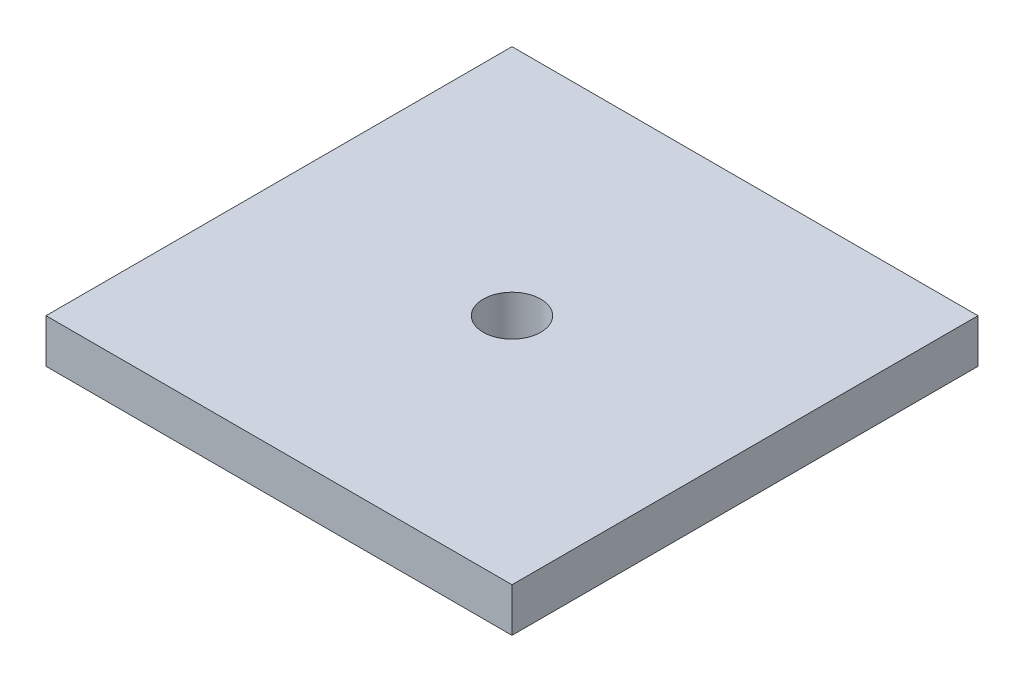
ISO-10303-21;
HEADER;
FILE_DESCRIPTION(('STEP AP214'),'2;1');
FILE_NAME('part.step','',(''),(''),'','','');
FILE_SCHEMA(('AUTOMOTIVE_DESIGN { 1 0 10303 214 1 1 1 1 }'));
ENDSEC;
DATA;
#1=APPLICATION_CONTEXT('core data for automotive mechanical design processes');
#2=APPLICATION_PROTOCOL_DEFINITION('international standard','automotive_design',2000,#1);
#3=PRODUCT_CONTEXT('',#1,'mechanical');
#4=PRODUCT('Part','Part','',(#3));
#5=PRODUCT_RELATED_PRODUCT_CATEGORY('part','',(#4));
#6=PRODUCT_DEFINITION_FORMATION('','',#4);
#7=PRODUCT_DEFINITION_CONTEXT('part definition',#1,'design');
#8=PRODUCT_DEFINITION('design','',#6,#7);
#9=PRODUCT_DEFINITION_SHAPE('','',#8);
#10=(LENGTH_UNIT() NAMED_UNIT(*) SI_UNIT(.MILLI.,.METRE.));
#11=(NAMED_UNIT(*) PLANE_ANGLE_UNIT() SI_UNIT($,.RADIAN.));
#12=(NAMED_UNIT(*) SI_UNIT($,.STERADIAN.) SOLID_ANGLE_UNIT());
#13=UNCERTAINTY_MEASURE_WITH_UNIT(LENGTH_MEASURE(1.E-05),#10,'distance_accuracy_value','');
#14=(GEOMETRIC_REPRESENTATION_CONTEXT(3) GLOBAL_UNCERTAINTY_ASSIGNED_CONTEXT((#13)) GLOBAL_UNIT_ASSIGNED_CONTEXT((#10,
#11,#12)) REPRESENTATION_CONTEXT('',''));
#15=CARTESIAN_POINT('',(0.,0.,0.));
#16=DIRECTION('',(0.,0.,1.));
#17=DIRECTION('',(1.,0.,0.));
#18=AXIS2_PLACEMENT_3D('',#15,#16,#17);
#19=CARTESIAN_POINT('',(-8.5,-1.6,8.5));
#20=DIRECTION('',(-1.,0.,0.));
#21=DIRECTION('',(0.,0.,1.));
#22=AXIS2_PLACEMENT_3D('',#19,#20,#21);
#23=PLANE('',#22);
#24=DIRECTION('',(0.,0.,1.));
#25=VECTOR('',#24,1.);
#26=CARTESIAN_POINT('',(-8.5,0.,8.5));
#27=LINE('',#26,#25);
#28=CARTESIAN_POINT('',(-8.5,0.,-8.5));
#29=VERTEX_POINT('',#28);
#30=CARTESIAN_POINT('',(-8.5,0.,8.5));
#31=VERTEX_POINT('',#30);
#32=EDGE_CURVE('E105',#29,#31,#27,.T.);
#33=ORIENTED_EDGE('',*,*,#32,.F.);
#34=DIRECTION('',(0.,1.,0.));
#35=VECTOR('',#34,1.);
#36=CARTESIAN_POINT('',(-8.5,-1.6,-8.5));
#37=LINE('',#36,#35);
#38=CARTESIAN_POINT('',(-8.5,-1.6,-8.5));
#39=VERTEX_POINT('',#38);
#40=EDGE_CURVE('E11',#39,#29,#37,.T.);
#41=ORIENTED_EDGE('',*,*,#40,.F.);
#42=DIRECTION('',(0.,0.,1.));
#43=VECTOR('',#42,1.);
#44=CARTESIAN_POINT('',(-8.5,-1.6,8.5));
#45=LINE('',#44,#43);
#46=CARTESIAN_POINT('',(-8.5,-1.6,8.5));
#47=VERTEX_POINT('',#46);
#48=EDGE_CURVE('E98',#39,#47,#45,.T.);
#49=ORIENTED_EDGE('',*,*,#48,.T.);
#50=DIRECTION('',(0.,1.,0.));
#51=VECTOR('',#50,1.);
#52=CARTESIAN_POINT('',(-8.5,-1.6,8.5));
#53=LINE('',#52,#51);
#54=EDGE_CURVE('E43',#47,#31,#53,.T.);
#55=ORIENTED_EDGE('',*,*,#54,.T.);
#56=EDGE_LOOP('',(#33,#41,#49,#55));
#57=FACE_BOUND('',#56,.T.);
#58=ADVANCED_FACE('F40',(#57),#23,.T.);
#59=CARTESIAN_POINT('',(8.5,-1.6,-8.5));
#60=DIRECTION('',(0.,0.,-1.));
#61=DIRECTION('',(-1.,0.,0.));
#62=AXIS2_PLACEMENT_3D('',#59,#60,#61);
#63=PLANE('',#62);
#64=DIRECTION('',(-1.,0.,0.));
#65=VECTOR('',#64,1.);
#66=CARTESIAN_POINT('',(8.5,0.,-8.5));
#67=LINE('',#66,#65);
#68=CARTESIAN_POINT('',(8.5,0.,-8.5));
#69=VERTEX_POINT('',#68);
#70=EDGE_CURVE('E100',#69,#29,#67,.T.);
#71=ORIENTED_EDGE('',*,*,#70,.F.);
#72=DIRECTION('',(0.,1.,0.));
#73=VECTOR('',#72,1.);
#74=CARTESIAN_POINT('',(8.5,-1.6,-8.5));
#75=LINE('',#74,#73);
#76=CARTESIAN_POINT('',(8.5,-1.6,-8.5));
#77=VERTEX_POINT('',#76);
#78=EDGE_CURVE('E49',#77,#69,#75,.T.);
#79=ORIENTED_EDGE('',*,*,#78,.F.);
#80=DIRECTION('',(-1.,0.,0.));
#81=VECTOR('',#80,1.);
#82=CARTESIAN_POINT('',(8.5,-1.6,-8.5));
#83=LINE('',#82,#81);
#84=EDGE_CURVE('E95',#77,#39,#83,.T.);
#85=ORIENTED_EDGE('',*,*,#84,.T.);
#86=ORIENTED_EDGE('',*,*,#40,.T.);
#87=EDGE_LOOP('',(#71,#79,#85,#86));
#88=FACE_BOUND('',#87,.T.);
#89=ADVANCED_FACE('F116',(#88),#63,.T.);
#90=CARTESIAN_POINT('',(8.5,-1.6,8.5));
#91=DIRECTION('',(1.,0.,0.));
#92=DIRECTION('',(0.,0.,-1.));
#93=AXIS2_PLACEMENT_3D('',#90,#91,#92);
#94=PLANE('',#93);
#95=DIRECTION('',(0.,0.,-1.));
#96=VECTOR('',#95,1.);
#97=CARTESIAN_POINT('',(8.5,0.,8.5));
#98=LINE('',#97,#96);
#99=CARTESIAN_POINT('',(8.5,0.,8.5));
#100=VERTEX_POINT('',#99);
#101=EDGE_CURVE('E90',#100,#69,#98,.T.);
#102=ORIENTED_EDGE('',*,*,#101,.F.);
#103=DIRECTION('',(0.,1.,0.));
#104=VECTOR('',#103,1.);
#105=CARTESIAN_POINT('',(8.5,-1.6,8.5));
#106=LINE('',#105,#104);
#107=CARTESIAN_POINT('',(8.5,-1.6,8.5));
#108=VERTEX_POINT('',#107);
#109=EDGE_CURVE('E85',#108,#100,#106,.T.);
#110=ORIENTED_EDGE('',*,*,#109,.F.);
#111=DIRECTION('',(0.,0.,-1.));
#112=VECTOR('',#111,1.);
#113=CARTESIAN_POINT('',(8.5,-1.6,8.5));
#114=LINE('',#113,#112);
#115=EDGE_CURVE('E88',#108,#77,#114,.T.);
#116=ORIENTED_EDGE('',*,*,#115,.T.);
#117=ORIENTED_EDGE('',*,*,#78,.T.);
#118=EDGE_LOOP('',(#102,#110,#116,#117));
#119=FACE_BOUND('',#118,.T.);
#120=ADVANCED_FACE('F87',(#119),#94,.T.);
#121=CARTESIAN_POINT('',(8.5,-1.6,8.5));
#122=DIRECTION('',(0.,0.,1.));
#123=DIRECTION('',(1.,0.,0.));
#124=AXIS2_PLACEMENT_3D('',#121,#122,#123);
#125=PLANE('',#124);
#126=DIRECTION('',(1.,0.,0.));
#127=VECTOR('',#126,1.);
#128=CARTESIAN_POINT('',(8.5,0.,8.5));
#129=LINE('',#128,#127);
#130=EDGE_CURVE('E108',#31,#100,#129,.T.);
#131=ORIENTED_EDGE('',*,*,#130,.F.);
#132=ORIENTED_EDGE('',*,*,#54,.F.);
#133=DIRECTION('',(1.,0.,0.));
#134=VECTOR('',#133,1.);
#135=CARTESIAN_POINT('',(8.5,-1.6,8.5));
#136=LINE('',#135,#134);
#137=EDGE_CURVE('E94',#47,#108,#136,.T.);
#138=ORIENTED_EDGE('',*,*,#137,.T.);
#139=ORIENTED_EDGE('',*,*,#109,.T.);
#140=EDGE_LOOP('',(#131,#132,#138,#139));
#141=FACE_BOUND('',#140,.T.);
#142=ADVANCED_FACE('F97',(#141),#125,.T.);
#143=CARTESIAN_POINT('',(0.,-1.6,0.));
#144=DIRECTION('',(0.,1.,0.));
#145=DIRECTION('',(0.,0.,1.));
#146=AXIS2_PLACEMENT_3D('',#143,#144,#145);
#147=PLANE('',#146);
#148=CARTESIAN_POINT('',(0.,-1.6,0.));
#149=DIRECTION('',(0.,1.,0.));
#150=DIRECTION('',(0.,0.,1.));
#151=AXIS2_PLACEMENT_3D('',#148,#149,#150);
#152=CIRCLE('',#151,1.05);
#153=CARTESIAN_POINT('',(0.,-1.6,1.05));
#154=VERTEX_POINT('',#153);
#155=EDGE_CURVE('E109',#154,#154,#152,.T.);
#156=ORIENTED_EDGE('',*,*,#155,.T.);
#157=EDGE_LOOP('',(#156));
#158=FACE_BOUND('',#157,.T.);
#159=ORIENTED_EDGE('',*,*,#48,.F.);
#160=ORIENTED_EDGE('',*,*,#84,.F.);
#161=ORIENTED_EDGE('',*,*,#115,.F.);
#162=ORIENTED_EDGE('',*,*,#137,.F.);
#163=EDGE_LOOP('',(#159,#160,#161,#162));
#164=FACE_BOUND('',#163,.T.);
#165=ADVANCED_FACE('F93',(#158,#164),#147,.F.);
#166=CARTESIAN_POINT('',(0.,0.,0.));
#167=DIRECTION('',(0.,1.,0.));
#168=DIRECTION('',(0.,0.,1.));
#169=AXIS2_PLACEMENT_3D('',#166,#167,#168);
#170=PLANE('',#169);
#171=CARTESIAN_POINT('',(0.,0.,0.));
#172=DIRECTION('',(0.,1.,0.));
#173=DIRECTION('',(0.,0.,1.));
#174=AXIS2_PLACEMENT_3D('',#171,#172,#173);
#175=CIRCLE('',#174,1.05);
#176=CARTESIAN_POINT('',(0.,0.,1.05));
#177=VERTEX_POINT('',#176);
#178=EDGE_CURVE('E146',#177,#177,#175,.T.);
#179=ORIENTED_EDGE('',*,*,#178,.F.);
#180=EDGE_LOOP('',(#179));
#181=FACE_BOUND('',#180,.T.);
#182=ORIENTED_EDGE('',*,*,#32,.T.);
#183=ORIENTED_EDGE('',*,*,#130,.T.);
#184=ORIENTED_EDGE('',*,*,#101,.T.);
#185=ORIENTED_EDGE('',*,*,#70,.T.);
#186=EDGE_LOOP('',(#182,#183,#184,#185));
#187=FACE_BOUND('',#186,.T.);
#188=ADVANCED_FACE('F115',(#181,#187),#170,.T.);
#189=CARTESIAN_POINT('',(0.,-1.6,0.));
#190=DIRECTION('',(0.,1.,0.));
#191=DIRECTION('',(0.,0.,1.));
#192=AXIS2_PLACEMENT_3D('',#189,#190,#191);
#193=CYLINDRICAL_SURFACE('',#192,1.05);
#194=ORIENTED_EDGE('',*,*,#155,.F.);
#195=EDGE_LOOP('',(#194));
#196=FACE_BOUND('',#195,.T.);
#197=ORIENTED_EDGE('',*,*,#178,.T.);
#198=EDGE_LOOP('',(#197));
#199=FACE_BOUND('',#198,.T.);
#200=ADVANCED_FACE('F134',(#196,#199),#193,.F.);
#201=CLOSED_SHELL('',(#58,#89,#120,#142,#165,#188,#200));
#202=MANIFOLD_SOLID_BREP('B2',#201);
#203=ADVANCED_BREP_SHAPE_REPRESENTATION('',(#18,#202),#14);
#204=SHAPE_DEFINITION_REPRESENTATION(#9,#203);
ENDSEC;
END-ISO-10303-21;
